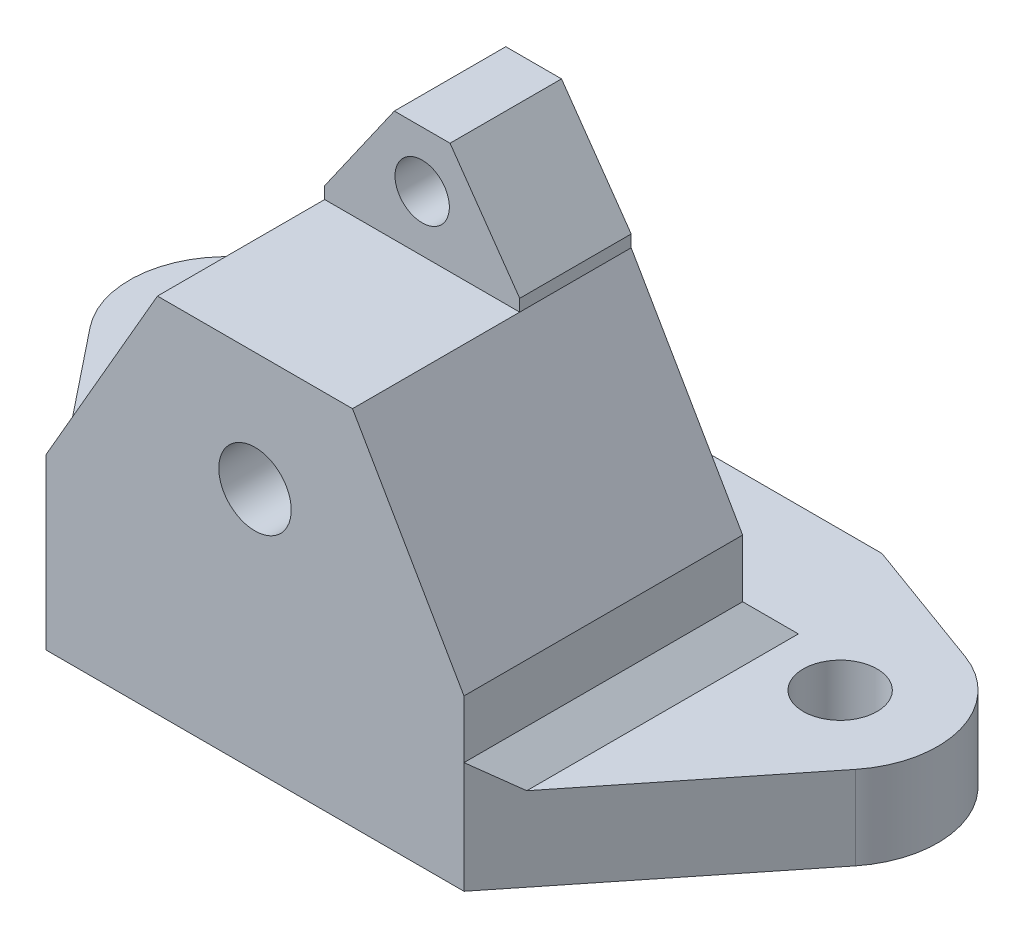
ISO-10303-21;
HEADER;
FILE_DESCRIPTION(('STEP AP214'),'2;1');
FILE_NAME('part.step','',(''),(''),'','','');
FILE_SCHEMA(('AUTOMOTIVE_DESIGN { 1 0 10303 214 1 1 1 1 }'));
ENDSEC;
DATA;
#1=APPLICATION_CONTEXT('core data for automotive mechanical design processes');
#2=APPLICATION_PROTOCOL_DEFINITION('international standard','automotive_design',2000,#1);
#3=PRODUCT_CONTEXT('',#1,'mechanical');
#4=PRODUCT('Part','Part','',(#3));
#5=PRODUCT_RELATED_PRODUCT_CATEGORY('part','',(#4));
#6=PRODUCT_DEFINITION_FORMATION('','',#4);
#7=PRODUCT_DEFINITION_CONTEXT('part definition',#1,'design');
#8=PRODUCT_DEFINITION('design','',#6,#7);
#9=PRODUCT_DEFINITION_SHAPE('','',#8);
#10=(LENGTH_UNIT() NAMED_UNIT(*) SI_UNIT(.MILLI.,.METRE.));
#11=(NAMED_UNIT(*) PLANE_ANGLE_UNIT() SI_UNIT($,.RADIAN.));
#12=(NAMED_UNIT(*) SI_UNIT($,.STERADIAN.) SOLID_ANGLE_UNIT());
#13=UNCERTAINTY_MEASURE_WITH_UNIT(LENGTH_MEASURE(1.E-05),#10,'distance_accuracy_value','');
#14=(GEOMETRIC_REPRESENTATION_CONTEXT(3) GLOBAL_UNCERTAINTY_ASSIGNED_CONTEXT((#13)) GLOBAL_UNIT_ASSIGNED_CONTEXT((#10,
#11,#12)) REPRESENTATION_CONTEXT('',''));
#15=CARTESIAN_POINT('',(0.,0.,0.));
#16=DIRECTION('',(0.,0.,1.));
#17=DIRECTION('',(1.,0.,0.));
#18=AXIS2_PLACEMENT_3D('',#15,#16,#17);
#19=CARTESIAN_POINT('',(15.,13.,30.));
#20=DIRECTION('',(-1.,0.,0.));
#21=DIRECTION('',(0.,-1.,0.));
#22=AXIS2_PLACEMENT_3D('',#19,#20,#21);
#23=PLANE('',#22);
#24=DIRECTION('',(0.,1.,0.));
#25=VECTOR('',#24,1.);
#26=CARTESIAN_POINT('',(15.,13.,30.));
#27=LINE('',#26,#25);
#28=CARTESIAN_POINT('',(15.,-4.99999999999997,30.));
#29=VERTEX_POINT('',#28);
#30=CARTESIAN_POINT('',(15.,-0.85640646055101,30.));
#31=VERTEX_POINT('',#30);
#32=EDGE_CURVE('E247',#29,#31,#27,.T.);
#33=ORIENTED_EDGE('',*,*,#32,.F.);
#34=DIRECTION('',(0.,0.,-1.));
#35=VECTOR('',#34,1.);
#36=CARTESIAN_POINT('',(15.,-4.99999999999998,10.));
#37=LINE('',#36,#35);
#38=CARTESIAN_POINT('',(15.,-4.99999999999998,10.));
#39=VERTEX_POINT('',#38);
#40=EDGE_CURVE('E259',#29,#39,#37,.T.);
#41=ORIENTED_EDGE('',*,*,#40,.T.);
#42=DIRECTION('',(0.,1.,0.));
#43=VECTOR('',#42,1.);
#44=CARTESIAN_POINT('',(15.,13.,10.));
#45=LINE('',#44,#43);
#46=CARTESIAN_POINT('',(15.,-0.856406460551011,10.));
#47=VERTEX_POINT('',#46);
#48=EDGE_CURVE('E291',#39,#47,#45,.T.);
#49=ORIENTED_EDGE('',*,*,#48,.T.);
#50=DIRECTION('',(0.,0.,1.));
#51=VECTOR('',#50,1.);
#52=CARTESIAN_POINT('',(15.,-0.856406460551015,30.));
#53=LINE('',#52,#51);
#54=EDGE_CURVE('E203',#47,#31,#53,.T.);
#55=ORIENTED_EDGE('',*,*,#54,.T.);
#56=EDGE_LOOP('',(#33,#41,#49,#55));
#57=FACE_BOUND('',#56,.T.);
#58=ADVANCED_FACE('F33',(#57),#23,.F.);
#59=CARTESIAN_POINT('',(-15.,13.,30.));
#60=DIRECTION('',(0.,-1.,0.));
#61=DIRECTION('',(0.,0.,-1.));
#62=AXIS2_PLACEMENT_3D('',#59,#60,#61);
#63=PLANE('',#62);
#64=DIRECTION('',(0.,0.,-1.));
#65=VECTOR('',#64,1.);
#66=CARTESIAN_POINT('',(6.99999999999999,13.,30.));
#67=LINE('',#66,#65);
#68=CARTESIAN_POINT('',(6.99999999999998,13.,30.));
#69=VERTEX_POINT('',#68);
#70=CARTESIAN_POINT('',(6.99999999999999,13.,18.));
#71=VERTEX_POINT('',#70);
#72=EDGE_CURVE('E193',#69,#71,#67,.T.);
#73=ORIENTED_EDGE('',*,*,#72,.T.);
#74=DIRECTION('',(-1.,0.,0.));
#75=VECTOR('',#74,1.);
#76=CARTESIAN_POINT('',(-6.99999999999999,13.,18.));
#77=LINE('',#76,#75);
#78=CARTESIAN_POINT('',(-6.99999999999999,13.,18.));
#79=VERTEX_POINT('',#78);
#80=EDGE_CURVE('E180',#71,#79,#77,.T.);
#81=ORIENTED_EDGE('',*,*,#80,.T.);
#82=DIRECTION('',(0.,0.,1.));
#83=VECTOR('',#82,1.);
#84=CARTESIAN_POINT('',(-6.99999999999999,13.,30.));
#85=LINE('',#84,#83);
#86=CARTESIAN_POINT('',(-6.99999999999999,13.,30.));
#87=VERTEX_POINT('',#86);
#88=EDGE_CURVE('E209',#79,#87,#85,.T.);
#89=ORIENTED_EDGE('',*,*,#88,.T.);
#90=DIRECTION('',(-1.,0.,0.));
#91=VECTOR('',#90,1.);
#92=CARTESIAN_POINT('',(-15.,13.,30.));
#93=LINE('',#92,#91);
#94=EDGE_CURVE('E202',#69,#87,#93,.T.);
#95=ORIENTED_EDGE('',*,*,#94,.F.);
#96=EDGE_LOOP('',(#73,#81,#89,#95));
#97=FACE_BOUND('',#96,.T.);
#98=ADVANCED_FACE('F200',(#97),#63,.F.);
#99=CARTESIAN_POINT('',(-15.,13.,30.));
#100=DIRECTION('',(1.,0.,0.));
#101=DIRECTION('',(0.,1.,0.));
#102=AXIS2_PLACEMENT_3D('',#99,#100,#101);
#103=PLANE('',#102);
#104=DIRECTION('',(0.,-1.,0.));
#105=VECTOR('',#104,1.);
#106=CARTESIAN_POINT('',(-15.,13.,10.));
#107=LINE('',#106,#105);
#108=CARTESIAN_POINT('',(-15.,-0.856406460551015,10.));
#109=VERTEX_POINT('',#108);
#110=CARTESIAN_POINT('',(-15.,-4.99999999999998,10.));
#111=VERTEX_POINT('',#110);
#112=EDGE_CURVE('E277',#109,#111,#107,.T.);
#113=ORIENTED_EDGE('',*,*,#112,.T.);
#114=DIRECTION('',(0.,0.,1.));
#115=VECTOR('',#114,1.);
#116=CARTESIAN_POINT('',(-15.,-4.99999999999998,30.));
#117=LINE('',#116,#115);
#118=CARTESIAN_POINT('',(-15.,-4.99999999999998,30.));
#119=VERTEX_POINT('',#118);
#120=EDGE_CURVE('E527',#111,#119,#117,.T.);
#121=ORIENTED_EDGE('',*,*,#120,.T.);
#122=DIRECTION('',(0.,-1.,0.));
#123=VECTOR('',#122,1.);
#124=CARTESIAN_POINT('',(-15.,13.,30.));
#125=LINE('',#124,#123);
#126=CARTESIAN_POINT('',(-15.,-0.856406460551013,30.));
#127=VERTEX_POINT('',#126);
#128=EDGE_CURVE('E221',#127,#119,#125,.T.);
#129=ORIENTED_EDGE('',*,*,#128,.F.);
#130=DIRECTION('',(0.,0.,-1.));
#131=VECTOR('',#130,1.);
#132=CARTESIAN_POINT('',(-15.,-0.856406460551015,30.));
#133=LINE('',#132,#131);
#134=EDGE_CURVE('E520',#127,#109,#133,.T.);
#135=ORIENTED_EDGE('',*,*,#134,.T.);
#136=EDGE_LOOP('',(#113,#121,#129,#135));
#137=FACE_BOUND('',#136,.T.);
#138=ADVANCED_FACE('F376',(#137),#103,.F.);
#139=CARTESIAN_POINT('',(-15.,-13.,30.));
#140=DIRECTION('',(0.,1.,0.));
#141=DIRECTION('',(0.,0.,1.));
#142=AXIS2_PLACEMENT_3D('',#139,#140,#141);
#143=PLANE('',#142);
#144=DIRECTION('',(1.,0.,0.));
#145=VECTOR('',#144,1.);
#146=CARTESIAN_POINT('',(-15.,-13.,0.));
#147=LINE('',#146,#145);
#148=CARTESIAN_POINT('',(-15.,-13.,0.));
#149=VERTEX_POINT('',#148);
#150=CARTESIAN_POINT('',(15.,-13.,0.));
#151=VERTEX_POINT('',#150);
#152=EDGE_CURVE('E235',#149,#151,#147,.T.);
#153=ORIENTED_EDGE('',*,*,#152,.T.);
#154=DIRECTION('',(0.939597315436242,0.,0.342281879194631));
#155=VECTOR('',#154,1.);
#156=CARTESIAN_POINT('',(15.,-13.,0.));
#157=LINE('',#156,#155);
#158=CARTESIAN_POINT('',(24.3959731543624,-13.,3.42281879194631));
#159=VERTEX_POINT('',#158);
#160=EDGE_CURVE('E307',#151,#159,#157,.T.);
#161=ORIENTED_EDGE('',*,*,#160,.T.);
#162=CARTESIAN_POINT('',(22.,-13.,10.));
#163=DIRECTION('',(0.,-1.,0.));
#164=DIRECTION('',(0.,0.,1.));
#165=AXIS2_PLACEMENT_3D('',#162,#163,#164);
#166=CIRCLE('',#165,7.);
#167=CARTESIAN_POINT('',(27.4721603563474,-13.,14.3652561247216));
#168=VERTEX_POINT('',#167);
#169=EDGE_CURVE('E300',#159,#168,#166,.T.);
#170=ORIENTED_EDGE('',*,*,#169,.T.);
#171=DIRECTION('',(-0.623608017817372,0.,0.78173719376392));
#172=VECTOR('',#171,1.);
#173=CARTESIAN_POINT('',(15.,-13.,30.));
#174=LINE('',#173,#172);
#175=CARTESIAN_POINT('',(15.,-13.,30.));
#176=VERTEX_POINT('',#175);
#177=EDGE_CURVE('E310',#168,#176,#174,.T.);
#178=ORIENTED_EDGE('',*,*,#177,.T.);
#179=DIRECTION('',(1.,0.,0.));
#180=VECTOR('',#179,1.);
#181=CARTESIAN_POINT('',(-15.,-13.,30.));
#182=LINE('',#181,#180);
#183=CARTESIAN_POINT('',(-15.,-13.,30.));
#184=VERTEX_POINT('',#183);
#185=EDGE_CURVE('E225',#184,#176,#182,.T.);
#186=ORIENTED_EDGE('',*,*,#185,.F.);
#187=DIRECTION('',(-0.623608017817372,0.,-0.78173719376392));
#188=VECTOR('',#187,1.);
#189=CARTESIAN_POINT('',(-15.,-13.,30.));
#190=LINE('',#189,#188);
#191=CARTESIAN_POINT('',(-27.4721603563474,-13.,14.3652561247216));
#192=VERTEX_POINT('',#191);
#193=EDGE_CURVE('E323',#184,#192,#190,.T.);
#194=ORIENTED_EDGE('',*,*,#193,.T.);
#195=CARTESIAN_POINT('',(-22.,-13.,10.));
#196=DIRECTION('',(0.,-1.,0.));
#197=DIRECTION('',(0.,0.,-1.));
#198=AXIS2_PLACEMENT_3D('',#195,#196,#197);
#199=CIRCLE('',#198,7.);
#200=CARTESIAN_POINT('',(-24.3959731543624,-13.,3.42281879194631));
#201=VERTEX_POINT('',#200);
#202=EDGE_CURVE('E333',#192,#201,#199,.T.);
#203=ORIENTED_EDGE('',*,*,#202,.T.);
#204=DIRECTION('',(0.939597315436242,0.,-0.34228187919463));
#205=VECTOR('',#204,1.);
#206=CARTESIAN_POINT('',(-15.,-13.,0.));
#207=LINE('',#206,#205);
#208=EDGE_CURVE('E336',#201,#149,#207,.T.);
#209=ORIENTED_EDGE('',*,*,#208,.T.);
#210=EDGE_LOOP('',(#153,#161,#170,#178,#186,#194,#203,#209));
#211=FACE_BOUND('',#210,.T.);
#212=CARTESIAN_POINT('',(-22.,-13.,10.));
#213=DIRECTION('',(0.,-1.,0.));
#214=DIRECTION('',(0.,0.,-1.));
#215=AXIS2_PLACEMENT_3D('',#212,#213,#214);
#216=CIRCLE('',#215,2.65);
#217=CARTESIAN_POINT('',(-22.,-13.,7.35));
#218=VERTEX_POINT('',#217);
#219=EDGE_CURVE('E317',#218,#218,#216,.T.);
#220=ORIENTED_EDGE('',*,*,#219,.F.);
#221=EDGE_LOOP('',(#220));
#222=FACE_BOUND('',#221,.T.);
#223=CARTESIAN_POINT('',(22.,-13.,10.));
#224=DIRECTION('',(0.,-1.,0.));
#225=DIRECTION('',(0.,0.,1.));
#226=AXIS2_PLACEMENT_3D('',#223,#224,#225);
#227=CIRCLE('',#226,2.65);
#228=CARTESIAN_POINT('',(22.,-13.,12.65));
#229=VERTEX_POINT('',#228);
#230=EDGE_CURVE('E296',#229,#229,#227,.T.);
#231=ORIENTED_EDGE('',*,*,#230,.F.);
#232=EDGE_LOOP('',(#231));
#233=FACE_BOUND('',#232,.T.);
#234=ADVANCED_FACE('F510',(#211,#222,#233),#143,.F.);
#235=CARTESIAN_POINT('',(0.,0.,30.));
#236=DIRECTION('',(0.,0.,1.));
#237=DIRECTION('',(1.,0.,0.));
#238=AXIS2_PLACEMENT_3D('',#235,#236,#237);
#239=PLANE('',#238);
#240=CARTESIAN_POINT('',(0.,4.5,30.));
#241=DIRECTION('',(0.,0.,1.));
#242=DIRECTION('',(1.,0.,0.));
#243=AXIS2_PLACEMENT_3D('',#240,#241,#242);
#244=CIRCLE('',#243,2.6);
#245=CARTESIAN_POINT('',(2.6,4.5,30.));
#246=VERTEX_POINT('',#245);
#247=EDGE_CURVE('E347',#246,#246,#244,.T.);
#248=ORIENTED_EDGE('',*,*,#247,.F.);
#249=EDGE_LOOP('',(#248));
#250=FACE_BOUND('',#249,.T.);
#251=EDGE_CURVE('E245',#176,#29,#27,.T.);
#252=ORIENTED_EDGE('',*,*,#251,.T.);
#253=ORIENTED_EDGE('',*,*,#32,.T.);
#254=DIRECTION('',(0.500000000000001,-0.866025403784438,0.));
#255=VECTOR('',#254,1.);
#256=CARTESIAN_POINT('',(10.8791651245988,6.28108891324554,30.));
#257=LINE('',#256,#255);
#258=EDGE_CURVE('E519',#31,#69,#257,.F.);
#259=ORIENTED_EDGE('',*,*,#258,.T.);
#260=ORIENTED_EDGE('',*,*,#94,.T.);
#261=DIRECTION('',(0.500000000000001,0.866025403784438,0.));
#262=VECTOR('',#261,1.);
#263=CARTESIAN_POINT('',(-10.8791651245988,6.28108891324554,30.));
#264=LINE('',#263,#262);
#265=EDGE_CURVE('E207',#87,#127,#264,.F.);
#266=ORIENTED_EDGE('',*,*,#265,.T.);
#267=ORIENTED_EDGE('',*,*,#128,.T.);
#268=DIRECTION('',(0.,-1.,0.));
#269=VECTOR('',#268,1.);
#270=CARTESIAN_POINT('',(-15.,-7.,30.));
#271=LINE('',#270,#269);
#272=EDGE_CURVE('E344',#119,#184,#271,.T.);
#273=ORIENTED_EDGE('',*,*,#272,.T.);
#274=ORIENTED_EDGE('',*,*,#185,.T.);
#275=EDGE_LOOP('',(#252,#253,#259,#260,#266,#267,#273,#274));
#276=FACE_BOUND('',#275,.T.);
#277=ADVANCED_FACE('F506',(#250,#276),#239,.T.);
#278=CARTESIAN_POINT('',(0.,0.,0.));
#279=DIRECTION('',(0.,0.,1.));
#280=DIRECTION('',(1.,0.,0.));
#281=AXIS2_PLACEMENT_3D('',#278,#279,#280);
#282=PLANE('',#281);
#283=DIRECTION('',(0.,-1.,0.));
#284=VECTOR('',#283,1.);
#285=CARTESIAN_POINT('',(-15.,-7.,0.));
#286=LINE('',#285,#284);
#287=CARTESIAN_POINT('',(-15.,-6.99999999999998,0.));
#288=VERTEX_POINT('',#287);
#289=EDGE_CURVE('E341',#288,#149,#286,.T.);
#290=ORIENTED_EDGE('',*,*,#289,.F.);
#291=DIRECTION('',(1.,0.,0.));
#292=VECTOR('',#291,1.);
#293=CARTESIAN_POINT('',(-20.,-6.99999999999998,0.));
#294=LINE('',#293,#292);
#295=CARTESIAN_POINT('',(15.,-6.99999999999998,0.));
#296=VERTEX_POINT('',#295);
#297=EDGE_CURVE('E272',#288,#296,#294,.T.);
#298=ORIENTED_EDGE('',*,*,#297,.T.);
#299=DIRECTION('',(0.,1.,0.));
#300=VECTOR('',#299,1.);
#301=CARTESIAN_POINT('',(15.,13.,0.));
#302=LINE('',#301,#300);
#303=EDGE_CURVE('E238',#151,#296,#302,.T.);
#304=ORIENTED_EDGE('',*,*,#303,.F.);
#305=ORIENTED_EDGE('',*,*,#152,.F.);
#306=EDGE_LOOP('',(#290,#298,#304,#305));
#307=FACE_BOUND('',#306,.T.);
#308=ADVANCED_FACE('F367',(#307),#282,.F.);
#309=CARTESIAN_POINT('',(0.,5.,15.));
#310=DIRECTION('',(0.,0.,-1.));
#311=DIRECTION('',(-1.,0.,0.));
#312=AXIS2_PLACEMENT_3D('',#309,#310,#311);
#313=CYLINDRICAL_SURFACE('',#312,5.25);
#314=CARTESIAN_POINT('',(0.,5.,10.));
#315=DIRECTION('',(0.,0.,1.));
#316=DIRECTION('',(1.,0.,0.));
#317=AXIS2_PLACEMENT_3D('',#314,#315,#316);
#318=CIRCLE('',#317,5.25);
#319=CARTESIAN_POINT('',(5.25,5.,10.));
#320=VERTEX_POINT('',#319);
#321=EDGE_CURVE('E293',#320,#320,#318,.T.);
#322=ORIENTED_EDGE('',*,*,#321,.F.);
#323=EDGE_LOOP('',(#322));
#324=FACE_BOUND('',#323,.T.);
#325=CARTESIAN_POINT('',(0.,5.,15.));
#326=DIRECTION('',(0.,0.,1.));
#327=DIRECTION('',(1.,0.,0.));
#328=AXIS2_PLACEMENT_3D('',#325,#326,#327);
#329=CIRCLE('',#328,5.25);
#330=CARTESIAN_POINT('',(5.25,5.,15.));
#331=VERTEX_POINT('',#330);
#332=EDGE_CURVE('E242',#331,#331,#329,.T.);
#333=ORIENTED_EDGE('',*,*,#332,.T.);
#334=EDGE_LOOP('',(#333));
#335=FACE_BOUND('',#334,.T.);
#336=ADVANCED_FACE('F354',(#324,#335),#313,.F.);
#337=CARTESIAN_POINT('',(0.,5.,15.));
#338=DIRECTION('',(0.,0.,1.));
#339=DIRECTION('',(1.,0.,0.));
#340=AXIS2_PLACEMENT_3D('',#337,#338,#339);
#341=PLANE('',#340);
#342=CARTESIAN_POINT('',(0.,4.5,15.));
#343=DIRECTION('',(0.,0.,1.));
#344=DIRECTION('',(1.,0.,0.));
#345=AXIS2_PLACEMENT_3D('',#342,#343,#344);
#346=CIRCLE('',#345,2.6);
#347=CARTESIAN_POINT('',(2.6,4.5,15.));
#348=VERTEX_POINT('',#347);
#349=EDGE_CURVE('E345',#348,#348,#346,.T.);
#350=ORIENTED_EDGE('',*,*,#349,.T.);
#351=EDGE_LOOP('',(#350));
#352=FACE_BOUND('',#351,.T.);
#353=ORIENTED_EDGE('',*,*,#332,.F.);
#354=EDGE_LOOP('',(#353));
#355=FACE_BOUND('',#354,.T.);
#356=ADVANCED_FACE('F356',(#352,#355),#341,.F.);
#357=CARTESIAN_POINT('',(0.,4.5,30.001));
#358=DIRECTION('',(0.,0.,-1.));
#359=DIRECTION('',(-1.,0.,0.));
#360=AXIS2_PLACEMENT_3D('',#357,#358,#359);
#361=CYLINDRICAL_SURFACE('',#360,2.6);
#362=ORIENTED_EDGE('',*,*,#247,.T.);
#363=EDGE_LOOP('',(#362));
#364=FACE_BOUND('',#363,.T.);
#365=ORIENTED_EDGE('',*,*,#349,.F.);
#366=EDGE_LOOP('',(#365));
#367=FACE_BOUND('',#366,.T.);
#368=ADVANCED_FACE('F358',(#364,#367),#361,.F.);
#369=CARTESIAN_POINT('',(-15.,-7.,0.));
#370=DIRECTION('',(-0.34228187919463,0.,-0.939597315436242));
#371=DIRECTION('',(-0.939597315436242,0.,0.342281879194631));
#372=AXIS2_PLACEMENT_3D('',#369,#370,#371);
#373=PLANE('',#372);
#374=ORIENTED_EDGE('',*,*,#208,.F.);
#375=DIRECTION('',(0.,-1.,0.));
#376=VECTOR('',#375,1.);
#377=CARTESIAN_POINT('',(-24.3959731543624,-7.,3.42281879194631));
#378=LINE('',#377,#376);
#379=CARTESIAN_POINT('',(-24.3959731543624,-7.,3.42281879194631));
#380=VERTEX_POINT('',#379);
#381=EDGE_CURVE('E339',#380,#201,#378,.T.);
#382=ORIENTED_EDGE('',*,*,#381,.F.);
#383=DIRECTION('',(0.939597315436242,0.,-0.34228187919463));
#384=VECTOR('',#383,1.);
#385=CARTESIAN_POINT('',(-15.,-7.,0.));
#386=LINE('',#385,#384);
#387=EDGE_CURVE('E329',#380,#288,#386,.T.);
#388=ORIENTED_EDGE('',*,*,#387,.T.);
#389=ORIENTED_EDGE('',*,*,#289,.T.);
#390=EDGE_LOOP('',(#374,#382,#388,#389));
#391=FACE_BOUND('',#390,.T.);
#392=ADVANCED_FACE('F365',(#391),#373,.T.);
#393=CARTESIAN_POINT('',(-22.,-7.,10.));
#394=DIRECTION('',(0.,-1.,0.));
#395=DIRECTION('',(0.,0.,-1.));
#396=AXIS2_PLACEMENT_3D('',#393,#394,#395);
#397=CYLINDRICAL_SURFACE('',#396,7.);
#398=ORIENTED_EDGE('',*,*,#202,.F.);
#399=DIRECTION('',(0.,-1.,0.));
#400=VECTOR('',#399,1.);
#401=CARTESIAN_POINT('',(-27.4721603563474,-7.,14.3652561247216));
#402=LINE('',#401,#400);
#403=CARTESIAN_POINT('',(-27.4721603563474,-7.,14.3652561247216));
#404=VERTEX_POINT('',#403);
#405=EDGE_CURVE('E342',#404,#192,#402,.T.);
#406=ORIENTED_EDGE('',*,*,#405,.F.);
#407=CARTESIAN_POINT('',(-22.,-7.,10.));
#408=DIRECTION('',(0.,-1.,0.));
#409=DIRECTION('',(0.,0.,-1.));
#410=AXIS2_PLACEMENT_3D('',#407,#408,#409);
#411=CIRCLE('',#410,7.);
#412=EDGE_CURVE('E326',#404,#380,#411,.T.);
#413=ORIENTED_EDGE('',*,*,#412,.T.);
#414=ORIENTED_EDGE('',*,*,#381,.T.);
#415=EDGE_LOOP('',(#398,#406,#413,#414));
#416=FACE_BOUND('',#415,.T.);
#417=ADVANCED_FACE('F490',(#416),#397,.T.);
#418=CARTESIAN_POINT('',(-15.,-7.,30.));
#419=DIRECTION('',(-0.78173719376392,0.,0.623608017817372));
#420=DIRECTION('',(0.623608017817372,0.,0.78173719376392));
#421=AXIS2_PLACEMENT_3D('',#418,#419,#420);
#422=PLANE('',#421);
#423=ORIENTED_EDGE('',*,*,#193,.F.);
#424=ORIENTED_EDGE('',*,*,#272,.F.);
#425=DIRECTION('',(0.529149317304264,0.529149317304272,0.663326465620703));
#426=VECTOR('',#425,1.);
#427=CARTESIAN_POINT('',(-15.,-4.99999999999998,30.));
#428=LINE('',#427,#426);
#429=CARTESIAN_POINT('',(-17.,-7.,27.4928571428571));
#430=VERTEX_POINT('',#429);
#431=EDGE_CURVE('E261',#119,#430,#428,.F.);
#432=ORIENTED_EDGE('',*,*,#431,.T.);
#433=DIRECTION('',(-0.623608017817372,0.,-0.78173719376392));
#434=VECTOR('',#433,1.);
#435=CARTESIAN_POINT('',(-15.,-7.,30.));
#436=LINE('',#435,#434);
#437=EDGE_CURVE('E330',#430,#404,#436,.T.);
#438=ORIENTED_EDGE('',*,*,#437,.T.);
#439=ORIENTED_EDGE('',*,*,#405,.T.);
#440=EDGE_LOOP('',(#423,#424,#432,#438,#439));
#441=FACE_BOUND('',#440,.T.);
#442=ADVANCED_FACE('F486',(#441),#422,.T.);
#443=CARTESIAN_POINT('',(-22.,-7.,10.));
#444=DIRECTION('',(0.,-1.,0.));
#445=DIRECTION('',(0.,0.,-1.));
#446=AXIS2_PLACEMENT_3D('',#443,#444,#445);
#447=PLANE('',#446);
#448=CARTESIAN_POINT('',(-22.,-7.,10.));
#449=DIRECTION('',(0.,-1.,0.));
#450=DIRECTION('',(0.,0.,-1.));
#451=AXIS2_PLACEMENT_3D('',#448,#449,#450);
#452=CIRCLE('',#451,2.65);
#453=CARTESIAN_POINT('',(-22.,-7.,7.35));
#454=VERTEX_POINT('',#453);
#455=EDGE_CURVE('E320',#454,#454,#452,.T.);
#456=ORIENTED_EDGE('',*,*,#455,.T.);
#457=EDGE_LOOP('',(#456));
#458=FACE_BOUND('',#457,.T.);
#459=ORIENTED_EDGE('',*,*,#437,.F.);
#460=DIRECTION('',(0.,0.,-1.));
#461=VECTOR('',#460,1.);
#462=CARTESIAN_POINT('',(-17.,-7.,10.));
#463=LINE('',#462,#461);
#464=CARTESIAN_POINT('',(-17.,-7.,8.00000000000001));
#465=VERTEX_POINT('',#464);
#466=EDGE_CURVE('E547',#430,#465,#463,.T.);
#467=ORIENTED_EDGE('',*,*,#466,.T.);
#468=DIRECTION('',(1.,0.,0.));
#469=VECTOR('',#468,1.);
#470=CARTESIAN_POINT('',(15.,-7.,8.00000000000001));
#471=LINE('',#470,#469);
#472=CARTESIAN_POINT('',(17.,-7.,8.00000000000001));
#473=VERTEX_POINT('',#472);
#474=EDGE_CURVE('E548',#465,#473,#471,.T.);
#475=ORIENTED_EDGE('',*,*,#474,.T.);
#476=DIRECTION('',(0.,0.,1.));
#477=VECTOR('',#476,1.);
#478=CARTESIAN_POINT('',(17.,-7.,30.));
#479=LINE('',#478,#477);
#480=CARTESIAN_POINT('',(17.,-7.,27.4928571428571));
#481=VERTEX_POINT('',#480);
#482=EDGE_CURVE('E530',#473,#481,#479,.T.);
#483=ORIENTED_EDGE('',*,*,#482,.T.);
#484=DIRECTION('',(-0.623608017817372,0.,0.78173719376392));
#485=VECTOR('',#484,1.);
#486=CARTESIAN_POINT('',(15.,-7.,30.));
#487=LINE('',#486,#485);
#488=CARTESIAN_POINT('',(27.4721603563474,-7.,14.3652561247216));
#489=VERTEX_POINT('',#488);
#490=EDGE_CURVE('E306',#489,#481,#487,.T.);
#491=ORIENTED_EDGE('',*,*,#490,.F.);
#492=CARTESIAN_POINT('',(22.,-7.,10.));
#493=DIRECTION('',(0.,-1.,0.));
#494=DIRECTION('',(0.,0.,1.));
#495=AXIS2_PLACEMENT_3D('',#492,#493,#494);
#496=CIRCLE('',#495,7.);
#497=CARTESIAN_POINT('',(24.3959731543624,-7.,3.42281879194631));
#498=VERTEX_POINT('',#497);
#499=EDGE_CURVE('E303',#498,#489,#496,.T.);
#500=ORIENTED_EDGE('',*,*,#499,.F.);
#501=DIRECTION('',(0.939597315436242,0.,0.342281879194631));
#502=VECTOR('',#501,1.);
#503=CARTESIAN_POINT('',(15.,-7.,0.));
#504=LINE('',#503,#502);
#505=EDGE_CURVE('E248',#296,#498,#504,.T.);
#506=ORIENTED_EDGE('',*,*,#505,.F.);
#507=ORIENTED_EDGE('',*,*,#297,.F.);
#508=ORIENTED_EDGE('',*,*,#387,.F.);
#509=ORIENTED_EDGE('',*,*,#412,.F.);
#510=EDGE_LOOP('',(#459,#467,#475,#483,#491,#500,#506,#507,#508,#509));
#511=FACE_BOUND('',#510,.T.);
#512=CARTESIAN_POINT('',(22.,-7.,10.));
#513=DIRECTION('',(0.,-1.,0.));
#514=DIRECTION('',(0.,0.,1.));
#515=AXIS2_PLACEMENT_3D('',#512,#513,#514);
#516=CIRCLE('',#515,2.65);
#517=CARTESIAN_POINT('',(22.,-7.,12.65));
#518=VERTEX_POINT('',#517);
#519=EDGE_CURVE('E297',#518,#518,#516,.T.);
#520=ORIENTED_EDGE('',*,*,#519,.T.);
#521=EDGE_LOOP('',(#520));
#522=FACE_BOUND('',#521,.T.);
#523=ADVANCED_FACE('F482',(#458,#511,#522),#447,.F.);
#524=CARTESIAN_POINT('',(-22.,-7.,10.));
#525=DIRECTION('',(0.,-1.,0.));
#526=DIRECTION('',(0.,0.,-1.));
#527=AXIS2_PLACEMENT_3D('',#524,#525,#526);
#528=CYLINDRICAL_SURFACE('',#527,2.65);
#529=ORIENTED_EDGE('',*,*,#455,.F.);
#530=EDGE_LOOP('',(#529));
#531=FACE_BOUND('',#530,.T.);
#532=ORIENTED_EDGE('',*,*,#219,.T.);
#533=EDGE_LOOP('',(#532));
#534=FACE_BOUND('',#533,.T.);
#535=ADVANCED_FACE('F478',(#531,#534),#528,.F.);
#536=CARTESIAN_POINT('',(22.,-7.,10.));
#537=DIRECTION('',(0.,-1.,0.));
#538=DIRECTION('',(0.,0.,-1.));
#539=AXIS2_PLACEMENT_3D('',#536,#537,#538);
#540=CYLINDRICAL_SURFACE('',#539,7.);
#541=ORIENTED_EDGE('',*,*,#169,.F.);
#542=DIRECTION('',(0.,-1.,0.));
#543=VECTOR('',#542,1.);
#544=CARTESIAN_POINT('',(24.3959731543624,-7.,3.42281879194631));
#545=LINE('',#544,#543);
#546=EDGE_CURVE('E315',#498,#159,#545,.T.);
#547=ORIENTED_EDGE('',*,*,#546,.F.);
#548=ORIENTED_EDGE('',*,*,#499,.T.);
#549=DIRECTION('',(0.,-1.,0.));
#550=VECTOR('',#549,1.);
#551=CARTESIAN_POINT('',(27.4721603563474,-7.,14.3652561247216));
#552=LINE('',#551,#550);
#553=EDGE_CURVE('E318',#489,#168,#552,.T.);
#554=ORIENTED_EDGE('',*,*,#553,.T.);
#555=EDGE_LOOP('',(#541,#547,#548,#554));
#556=FACE_BOUND('',#555,.T.);
#557=ADVANCED_FACE('F471',(#556),#540,.T.);
#558=CARTESIAN_POINT('',(15.,-7.,0.));
#559=DIRECTION('',(0.342281879194631,0.,-0.939597315436242));
#560=DIRECTION('',(-0.939597315436242,0.,-0.342281879194631));
#561=AXIS2_PLACEMENT_3D('',#558,#559,#560);
#562=PLANE('',#561);
#563=ORIENTED_EDGE('',*,*,#160,.F.);
#564=ORIENTED_EDGE('',*,*,#303,.T.);
#565=ORIENTED_EDGE('',*,*,#505,.T.);
#566=ORIENTED_EDGE('',*,*,#546,.T.);
#567=EDGE_LOOP('',(#563,#564,#565,#566));
#568=FACE_BOUND('',#567,.T.);
#569=ADVANCED_FACE('F468',(#568),#562,.T.);
#570=CARTESIAN_POINT('',(15.,-7.,30.));
#571=DIRECTION('',(0.78173719376392,0.,0.623608017817372));
#572=DIRECTION('',(0.623608017817372,0.,-0.78173719376392));
#573=AXIS2_PLACEMENT_3D('',#570,#571,#572);
#574=PLANE('',#573);
#575=ORIENTED_EDGE('',*,*,#177,.F.);
#576=ORIENTED_EDGE('',*,*,#553,.F.);
#577=ORIENTED_EDGE('',*,*,#490,.T.);
#578=DIRECTION('',(0.529149317304265,-0.529149317304271,-0.663326465620704));
#579=VECTOR('',#578,1.);
#580=CARTESIAN_POINT('',(15.,-4.99999999999998,30.));
#581=LINE('',#580,#579);
#582=EDGE_CURVE('E263',#481,#29,#581,.F.);
#583=ORIENTED_EDGE('',*,*,#582,.T.);
#584=ORIENTED_EDGE('',*,*,#251,.F.);
#585=EDGE_LOOP('',(#575,#576,#577,#583,#584));
#586=FACE_BOUND('',#585,.T.);
#587=ADVANCED_FACE('F466',(#586),#574,.T.);
#588=CARTESIAN_POINT('',(22.,-7.,10.));
#589=DIRECTION('',(0.,-1.,0.));
#590=DIRECTION('',(0.,0.,-1.));
#591=AXIS2_PLACEMENT_3D('',#588,#589,#590);
#592=CYLINDRICAL_SURFACE('',#591,2.65);
#593=ORIENTED_EDGE('',*,*,#519,.F.);
#594=EDGE_LOOP('',(#593));
#595=FACE_BOUND('',#594,.T.);
#596=ORIENTED_EDGE('',*,*,#230,.T.);
#597=EDGE_LOOP('',(#596));
#598=FACE_BOUND('',#597,.T.);
#599=ADVANCED_FACE('F384',(#595,#598),#592,.F.);
#600=CARTESIAN_POINT('',(6.99999999999999,13.,30.));
#601=DIRECTION('',(-0.866025403784438,-0.500000000000001,0.));
#602=DIRECTION('',(0.,0.,-1.));
#603=AXIS2_PLACEMENT_3D('',#600,#601,#602);
#604=PLANE('',#603);
#605=DIRECTION('',(-0.500000000000001,0.866025403784438,0.));
#606=VECTOR('',#605,1.);
#607=CARTESIAN_POINT('',(6.99999999999999,13.,10.));
#608=LINE('',#607,#606);
#609=CARTESIAN_POINT('',(6.99999999999999,13.,10.));
#610=VERTEX_POINT('',#609);
#611=EDGE_CURVE('E196',#610,#47,#608,.F.);
#612=ORIENTED_EDGE('',*,*,#611,.F.);
#613=DIRECTION('',(0.,0.,-1.));
#614=VECTOR('',#613,1.);
#615=CARTESIAN_POINT('',(6.99999999999999,13.,18.));
#616=LINE('',#615,#614);
#617=EDGE_CURVE('E174',#71,#610,#616,.T.);
#618=ORIENTED_EDGE('',*,*,#617,.F.);
#619=ORIENTED_EDGE('',*,*,#72,.F.);
#620=ORIENTED_EDGE('',*,*,#258,.F.);
#621=ORIENTED_EDGE('',*,*,#54,.F.);
#622=EDGE_LOOP('',(#612,#618,#619,#620,#621));
#623=FACE_BOUND('',#622,.T.);
#624=ADVANCED_FACE('F191',(#623),#604,.F.);
#625=CARTESIAN_POINT('',(-15.,-0.856406460551015,30.));
#626=DIRECTION('',(0.866025403784438,-0.500000000000001,0.));
#627=DIRECTION('',(0.,0.,-1.));
#628=AXIS2_PLACEMENT_3D('',#625,#626,#627);
#629=PLANE('',#628);
#630=DIRECTION('',(-0.500000000000001,-0.866025403784438,0.));
#631=VECTOR('',#630,1.);
#632=CARTESIAN_POINT('',(-15.,-0.856406460551015,10.));
#633=LINE('',#632,#631);
#634=CARTESIAN_POINT('',(-6.99999999999999,13.,10.));
#635=VERTEX_POINT('',#634);
#636=EDGE_CURVE('E522',#109,#635,#633,.F.);
#637=ORIENTED_EDGE('',*,*,#636,.F.);
#638=ORIENTED_EDGE('',*,*,#134,.F.);
#639=ORIENTED_EDGE('',*,*,#265,.F.);
#640=ORIENTED_EDGE('',*,*,#88,.F.);
#641=EDGE_CURVE('E204',#635,#79,#85,.T.);
#642=ORIENTED_EDGE('',*,*,#641,.F.);
#643=EDGE_LOOP('',(#637,#638,#639,#640,#642));
#644=FACE_BOUND('',#643,.T.);
#645=ADVANCED_FACE('F383',(#644),#629,.F.);
#646=CARTESIAN_POINT('',(-20.,13.,10.));
#647=DIRECTION('',(0.,0.,1.));
#648=DIRECTION('',(1.,0.,0.));
#649=AXIS2_PLACEMENT_3D('',#646,#647,#648);
#650=PLANE('',#649);
#651=ORIENTED_EDGE('',*,*,#321,.T.);
#652=EDGE_LOOP('',(#651));
#653=FACE_BOUND('',#652,.T.);
#654=DIRECTION('',(1.,0.,0.));
#655=VECTOR('',#654,1.);
#656=CARTESIAN_POINT('',(6.99999999999999,21.,10.));
#657=LINE('',#656,#655);
#658=CARTESIAN_POINT('',(-1.99999999999998,21.,10.));
#659=VERTEX_POINT('',#658);
#660=CARTESIAN_POINT('',(1.99999999999998,21.,10.));
#661=VERTEX_POINT('',#660);
#662=EDGE_CURVE('E430',#659,#661,#657,.T.);
#663=ORIENTED_EDGE('',*,*,#662,.T.);
#664=DIRECTION('',(-0.573576436351047,0.819152044288991,0.));
#665=VECTOR('',#664,1.);
#666=CARTESIAN_POINT('',(1.99999999999998,21.,10.));
#667=LINE('',#666,#665);
#668=CARTESIAN_POINT('',(6.99999999999999,13.8592599662895,10.));
#669=VERTEX_POINT('',#668);
#670=EDGE_CURVE('E415',#661,#669,#667,.F.);
#671=ORIENTED_EDGE('',*,*,#670,.T.);
#672=DIRECTION('',(0.,-1.,0.));
#673=VECTOR('',#672,1.);
#674=CARTESIAN_POINT('',(6.99999999999999,13.,10.));
#675=LINE('',#674,#673);
#676=EDGE_CURVE('E187',#669,#610,#675,.T.);
#677=ORIENTED_EDGE('',*,*,#676,.T.);
#678=ORIENTED_EDGE('',*,*,#611,.T.);
#679=ORIENTED_EDGE('',*,*,#48,.F.);
#680=DIRECTION('',(-1.,0.,0.));
#681=VECTOR('',#680,1.);
#682=CARTESIAN_POINT('',(-15.,-4.99999999999998,10.));
#683=LINE('',#682,#681);
#684=EDGE_CURVE('E257',#39,#111,#683,.T.);
#685=ORIENTED_EDGE('',*,*,#684,.T.);
#686=ORIENTED_EDGE('',*,*,#112,.F.);
#687=ORIENTED_EDGE('',*,*,#636,.T.);
#688=DIRECTION('',(0.,1.,0.));
#689=VECTOR('',#688,1.);
#690=CARTESIAN_POINT('',(-6.99999999999999,21.,10.));
#691=LINE('',#690,#689);
#692=CARTESIAN_POINT('',(-6.99999999999999,13.8592599662895,10.));
#693=VERTEX_POINT('',#692);
#694=EDGE_CURVE('E431',#635,#693,#691,.T.);
#695=ORIENTED_EDGE('',*,*,#694,.T.);
#696=DIRECTION('',(-0.573576436351047,-0.819152044288991,0.));
#697=VECTOR('',#696,1.);
#698=CARTESIAN_POINT('',(-6.99999999999999,13.8592599662895,10.));
#699=LINE('',#698,#697);
#700=EDGE_CURVE('E424',#693,#659,#699,.F.);
#701=ORIENTED_EDGE('',*,*,#700,.T.);
#702=EDGE_LOOP('',(#663,#671,#677,#678,#679,#685,#686,#687,#695,#701));
#703=FACE_BOUND('',#702,.T.);
#704=CARTESIAN_POINT('',(0.,17.,10.));
#705=DIRECTION('',(0.,0.,-1.));
#706=DIRECTION('',(-1.,0.,0.));
#707=AXIS2_PLACEMENT_3D('',#704,#705,#706);
#708=CIRCLE('',#707,1.95);
#709=CARTESIAN_POINT('',(-1.95,17.,10.));
#710=VERTEX_POINT('',#709);
#711=EDGE_CURVE('E439',#710,#710,#708,.T.);
#712=ORIENTED_EDGE('',*,*,#711,.F.);
#713=EDGE_LOOP('',(#712));
#714=FACE_BOUND('',#713,.T.);
#715=ADVANCED_FACE('F387',(#653,#703,#714),#650,.F.);
#716=CARTESIAN_POINT('',(15.,-4.99999999999998,30.));
#717=DIRECTION('',(0.707106781186551,0.707106781186544,0.));
#718=DIRECTION('',(0.,0.,1.));
#719=AXIS2_PLACEMENT_3D('',#716,#717,#718);
#720=PLANE('',#719);
#721=ORIENTED_EDGE('',*,*,#582,.F.);
#722=ORIENTED_EDGE('',*,*,#482,.F.);
#723=DIRECTION('',(-0.577350269189624,0.57735026918963,0.577350269189624));
#724=VECTOR('',#723,1.);
#725=CARTESIAN_POINT('',(8.33333333333338,1.66666666666671,16.6666666666666));
#726=LINE('',#725,#724);
#727=EDGE_CURVE('E214',#39,#473,#726,.F.);
#728=ORIENTED_EDGE('',*,*,#727,.F.);
#729=ORIENTED_EDGE('',*,*,#40,.F.);
#730=EDGE_LOOP('',(#721,#722,#728,#729));
#731=FACE_BOUND('',#730,.T.);
#732=ADVANCED_FACE('F395',(#731),#720,.T.);
#733=CARTESIAN_POINT('',(-22.,-7.,8.00000000000001));
#734=DIRECTION('',(0.,0.707106781186544,-0.707106781186551));
#735=DIRECTION('',(-1.,0.,0.));
#736=AXIS2_PLACEMENT_3D('',#733,#734,#735);
#737=PLANE('',#736);
#738=ORIENTED_EDGE('',*,*,#727,.T.);
#739=ORIENTED_EDGE('',*,*,#474,.F.);
#740=DIRECTION('',(0.577350269189622,0.57735026918963,0.577350269189625));
#741=VECTOR('',#740,1.);
#742=CARTESIAN_POINT('',(-18.6666666666666,-8.66666666666667,6.33333333333336));
#743=LINE('',#742,#741);
#744=EDGE_CURVE('E197',#111,#465,#743,.F.);
#745=ORIENTED_EDGE('',*,*,#744,.F.);
#746=ORIENTED_EDGE('',*,*,#684,.F.);
#747=EDGE_LOOP('',(#738,#739,#745,#746));
#748=FACE_BOUND('',#747,.T.);
#749=ADVANCED_FACE('F392',(#748),#737,.T.);
#750=CARTESIAN_POINT('',(-15.,-4.99999999999998,30.));
#751=DIRECTION('',(-0.707106781186552,0.707106781186542,0.));
#752=DIRECTION('',(0.,0.,-1.));
#753=AXIS2_PLACEMENT_3D('',#750,#751,#752);
#754=PLANE('',#753);
#755=ORIENTED_EDGE('',*,*,#744,.T.);
#756=ORIENTED_EDGE('',*,*,#466,.F.);
#757=ORIENTED_EDGE('',*,*,#431,.F.);
#758=ORIENTED_EDGE('',*,*,#120,.F.);
#759=EDGE_LOOP('',(#755,#756,#757,#758));
#760=FACE_BOUND('',#759,.T.);
#761=ADVANCED_FACE('F389',(#760),#754,.T.);
#762=CARTESIAN_POINT('',(6.99999999999999,13.,18.));
#763=DIRECTION('',(1.,0.,0.));
#764=DIRECTION('',(0.,0.,-1.));
#765=AXIS2_PLACEMENT_3D('',#762,#763,#764);
#766=PLANE('',#765);
#767=ORIENTED_EDGE('',*,*,#676,.F.);
#768=DIRECTION('',(0.,0.,1.));
#769=VECTOR('',#768,1.);
#770=CARTESIAN_POINT('',(6.99999999999999,13.8592599662895,18.));
#771=LINE('',#770,#769);
#772=CARTESIAN_POINT('',(6.99999999999998,13.8592599662895,18.));
#773=VERTEX_POINT('',#772);
#774=EDGE_CURVE('E56',#669,#773,#771,.T.);
#775=ORIENTED_EDGE('',*,*,#774,.T.);
#776=DIRECTION('',(0.,-1.,0.));
#777=VECTOR('',#776,1.);
#778=CARTESIAN_POINT('',(6.99999999999999,13.,18.));
#779=LINE('',#778,#777);
#780=EDGE_CURVE('E170',#773,#71,#779,.T.);
#781=ORIENTED_EDGE('',*,*,#780,.T.);
#782=ORIENTED_EDGE('',*,*,#617,.T.);
#783=EDGE_LOOP('',(#767,#775,#781,#782));
#784=FACE_BOUND('',#783,.T.);
#785=ADVANCED_FACE('F172',(#784),#766,.T.);
#786=CARTESIAN_POINT('',(6.99999999999999,21.,18.));
#787=DIRECTION('',(0.,1.,0.));
#788=DIRECTION('',(0.,0.,1.));
#789=AXIS2_PLACEMENT_3D('',#786,#787,#788);
#790=PLANE('',#789);
#791=DIRECTION('',(1.,0.,0.));
#792=VECTOR('',#791,1.);
#793=CARTESIAN_POINT('',(6.99999999999999,21.,18.));
#794=LINE('',#793,#792);
#795=CARTESIAN_POINT('',(-1.99999999999998,21.,18.));
#796=VERTEX_POINT('',#795);
#797=CARTESIAN_POINT('',(1.99999999999998,21.,18.));
#798=VERTEX_POINT('',#797);
#799=EDGE_CURVE('E177',#796,#798,#794,.T.);
#800=ORIENTED_EDGE('',*,*,#799,.T.);
#801=DIRECTION('',(0.,0.,-1.));
#802=VECTOR('',#801,1.);
#803=CARTESIAN_POINT('',(1.99999999999998,21.,18.));
#804=LINE('',#803,#802);
#805=EDGE_CURVE('E411',#798,#661,#804,.T.);
#806=ORIENTED_EDGE('',*,*,#805,.T.);
#807=ORIENTED_EDGE('',*,*,#662,.F.);
#808=DIRECTION('',(0.,0.,1.));
#809=VECTOR('',#808,1.);
#810=CARTESIAN_POINT('',(-1.99999999999998,21.,18.));
#811=LINE('',#810,#809);
#812=EDGE_CURVE('E265',#659,#796,#811,.T.);
#813=ORIENTED_EDGE('',*,*,#812,.T.);
#814=EDGE_LOOP('',(#800,#806,#807,#813));
#815=FACE_BOUND('',#814,.T.);
#816=ADVANCED_FACE('F450',(#815),#790,.T.);
#817=CARTESIAN_POINT('',(-6.99999999999999,21.,18.));
#818=DIRECTION('',(-1.,0.,0.));
#819=DIRECTION('',(0.,0.,1.));
#820=AXIS2_PLACEMENT_3D('',#817,#818,#819);
#821=PLANE('',#820);
#822=DIRECTION('',(0.,1.,0.));
#823=VECTOR('',#822,1.);
#824=CARTESIAN_POINT('',(-6.99999999999999,21.,18.));
#825=LINE('',#824,#823);
#826=CARTESIAN_POINT('',(-6.99999999999999,13.8592599662895,18.));
#827=VERTEX_POINT('',#826);
#828=EDGE_CURVE('E182',#79,#827,#825,.T.);
#829=ORIENTED_EDGE('',*,*,#828,.T.);
#830=DIRECTION('',(0.,0.,-1.));
#831=VECTOR('',#830,1.);
#832=CARTESIAN_POINT('',(-6.99999999999999,13.8592599662895,18.));
#833=LINE('',#832,#831);
#834=EDGE_CURVE('E11',#827,#693,#833,.T.);
#835=ORIENTED_EDGE('',*,*,#834,.T.);
#836=ORIENTED_EDGE('',*,*,#694,.F.);
#837=ORIENTED_EDGE('',*,*,#641,.T.);
#838=EDGE_LOOP('',(#829,#835,#836,#837));
#839=FACE_BOUND('',#838,.T.);
#840=ADVANCED_FACE('F446',(#839),#821,.T.);
#841=CARTESIAN_POINT('',(0.,0.,18.));
#842=DIRECTION('',(0.,0.,1.));
#843=DIRECTION('',(1.,0.,0.));
#844=AXIS2_PLACEMENT_3D('',#841,#842,#843);
#845=PLANE('',#844);
#846=CARTESIAN_POINT('',(0.,17.,18.));
#847=DIRECTION('',(0.,0.,-1.));
#848=DIRECTION('',(-1.,0.,0.));
#849=AXIS2_PLACEMENT_3D('',#846,#847,#848);
#850=CIRCLE('',#849,1.95);
#851=CARTESIAN_POINT('',(-1.95,17.,18.));
#852=VERTEX_POINT('',#851);
#853=EDGE_CURVE('E435',#852,#852,#850,.T.);
#854=ORIENTED_EDGE('',*,*,#853,.T.);
#855=EDGE_LOOP('',(#854));
#856=FACE_BOUND('',#855,.T.);
#857=ORIENTED_EDGE('',*,*,#780,.F.);
#858=DIRECTION('',(0.573576436351047,-0.819152044288991,0.));
#859=VECTOR('',#858,1.);
#860=CARTESIAN_POINT('',(11.2087926615777,7.84848111586641,18.));
#861=LINE('',#860,#859);
#862=EDGE_CURVE('E41',#773,#798,#861,.F.);
#863=ORIENTED_EDGE('',*,*,#862,.T.);
#864=ORIENTED_EDGE('',*,*,#799,.F.);
#865=DIRECTION('',(0.573576436351047,0.819152044288991,0.));
#866=VECTOR('',#865,1.);
#867=CARTESIAN_POINT('',(-11.2087926615777,7.84848111586641,18.));
#868=LINE('',#867,#866);
#869=EDGE_CURVE('E48',#796,#827,#868,.F.);
#870=ORIENTED_EDGE('',*,*,#869,.T.);
#871=ORIENTED_EDGE('',*,*,#828,.F.);
#872=ORIENTED_EDGE('',*,*,#80,.F.);
#873=EDGE_LOOP('',(#857,#863,#864,#870,#871,#872));
#874=FACE_BOUND('',#873,.T.);
#875=ADVANCED_FACE('F181',(#856,#874),#845,.T.);
#876=CARTESIAN_POINT('',(0.,17.,18.));
#877=DIRECTION('',(0.,0.,-1.));
#878=DIRECTION('',(-1.,0.,0.));
#879=AXIS2_PLACEMENT_3D('',#876,#877,#878);
#880=CYLINDRICAL_SURFACE('',#879,1.95);
#881=ORIENTED_EDGE('',*,*,#853,.F.);
#882=EDGE_LOOP('',(#881));
#883=FACE_BOUND('',#882,.T.);
#884=ORIENTED_EDGE('',*,*,#711,.T.);
#885=EDGE_LOOP('',(#884));
#886=FACE_BOUND('',#885,.T.);
#887=ADVANCED_FACE('F400',(#883,#886),#880,.F.);
#888=CARTESIAN_POINT('',(1.99999999999998,21.,18.));
#889=DIRECTION('',(-0.819152044288991,-0.573576436351047,0.));
#890=DIRECTION('',(0.,0.,-1.));
#891=AXIS2_PLACEMENT_3D('',#888,#889,#890);
#892=PLANE('',#891);
#893=ORIENTED_EDGE('',*,*,#862,.F.);
#894=ORIENTED_EDGE('',*,*,#774,.F.);
#895=ORIENTED_EDGE('',*,*,#670,.F.);
#896=ORIENTED_EDGE('',*,*,#805,.F.);
#897=EDGE_LOOP('',(#893,#894,#895,#896));
#898=FACE_BOUND('',#897,.T.);
#899=ADVANCED_FACE('F398',(#898),#892,.F.);
#900=CARTESIAN_POINT('',(-6.99999999999999,13.8592599662895,18.));
#901=DIRECTION('',(0.819152044288991,-0.573576436351047,0.));
#902=DIRECTION('',(0.,0.,-1.));
#903=AXIS2_PLACEMENT_3D('',#900,#901,#902);
#904=PLANE('',#903);
#905=ORIENTED_EDGE('',*,*,#869,.F.);
#906=ORIENTED_EDGE('',*,*,#812,.F.);
#907=ORIENTED_EDGE('',*,*,#700,.F.);
#908=ORIENTED_EDGE('',*,*,#834,.F.);
#909=EDGE_LOOP('',(#905,#906,#907,#908));
#910=FACE_BOUND('',#909,.T.);
#911=ADVANCED_FACE('F35',(#910),#904,.F.);
#912=CLOSED_SHELL('',(#58,#98,#138,#234,#277,#308,#336,#356,#368,#392,#417,#442,#523,#535,#557,
#569,#587,#599,#624,#645,#715,#732,#749,#761,#785,#816,#840,#875,#887,#899,#911));
#913=MANIFOLD_SOLID_BREP('B2',#912);
#914=ADVANCED_BREP_SHAPE_REPRESENTATION('',(#18,#913),#14);
#915=SHAPE_DEFINITION_REPRESENTATION(#9,#914);
ENDSEC;
END-ISO-10303-21;
